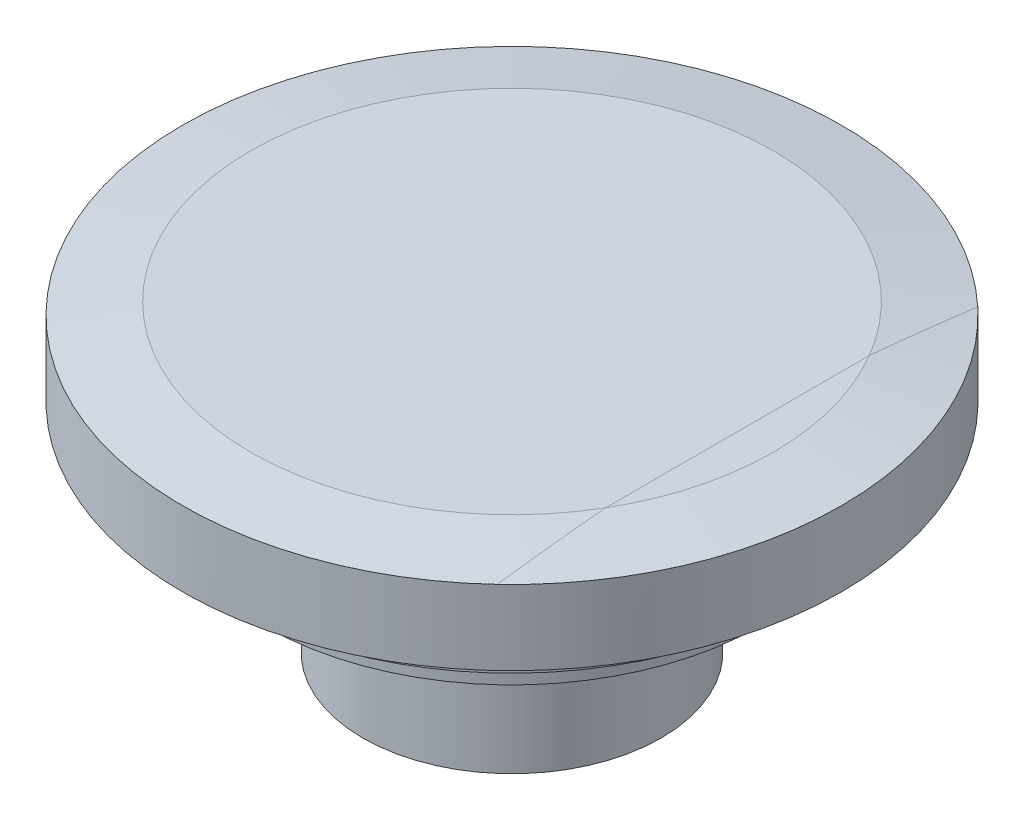
ISO-10303-21;
HEADER;
FILE_DESCRIPTION(('STEP AP214'),'2;1');
FILE_NAME('part.step','',(''),(''),'','','');
FILE_SCHEMA(('AUTOMOTIVE_DESIGN { 1 0 10303 214 1 1 1 1 }'));
ENDSEC;
DATA;
#1=APPLICATION_CONTEXT('core data for automotive mechanical design processes');
#2=APPLICATION_PROTOCOL_DEFINITION('international standard','automotive_design',2000,#1);
#3=PRODUCT_CONTEXT('',#1,'mechanical');
#4=PRODUCT('Part','Part','',(#3));
#5=PRODUCT_RELATED_PRODUCT_CATEGORY('part','',(#4));
#6=PRODUCT_DEFINITION_FORMATION('','',#4);
#7=PRODUCT_DEFINITION_CONTEXT('part definition',#1,'design');
#8=PRODUCT_DEFINITION('design','',#6,#7);
#9=PRODUCT_DEFINITION_SHAPE('','',#8);
#10=(LENGTH_UNIT() NAMED_UNIT(*) SI_UNIT(.MILLI.,.METRE.));
#11=(NAMED_UNIT(*) PLANE_ANGLE_UNIT() SI_UNIT($,.RADIAN.));
#12=(NAMED_UNIT(*) SI_UNIT($,.STERADIAN.) SOLID_ANGLE_UNIT());
#13=UNCERTAINTY_MEASURE_WITH_UNIT(LENGTH_MEASURE(1.E-05),#10,'distance_accuracy_value','');
#14=(GEOMETRIC_REPRESENTATION_CONTEXT(3) GLOBAL_UNCERTAINTY_ASSIGNED_CONTEXT((#13)) GLOBAL_UNIT_ASSIGNED_CONTEXT((#10,
#11,#12)) REPRESENTATION_CONTEXT('',''));
#15=CARTESIAN_POINT('',(0.,0.,0.));
#16=DIRECTION('',(0.,0.,1.));
#17=DIRECTION('',(1.,0.,0.));
#18=AXIS2_PLACEMENT_3D('',#15,#16,#17);
#19=CARTESIAN_POINT('',(0.,9.98173626503273,0.));
#20=DIRECTION('',(0.,-1.,0.));
#21=DIRECTION('',(1.,0.,0.));
#22=AXIS2_PLACEMENT_3D('',#19,#20,#21);
#23=CONICAL_SURFACE('',#22,19.,1.39626340159547);
#24=CARTESIAN_POINT('',(0.,9.98173626503273,0.));
#25=DIRECTION('',(0.,-1.,0.));
#26=DIRECTION('',(1.,0.,0.));
#27=AXIS2_PLACEMENT_3D('',#24,#25,#26);
#28=CIRCLE('',#27,19.);
#29=CARTESIAN_POINT('',(13.,9.98173626503273,13.856406460551));
#30=VERTEX_POINT('',#29);
#31=CARTESIAN_POINT('',(13.,9.98173626503273,-13.856406460551));
#32=VERTEX_POINT('',#31);
#33=EDGE_CURVE('E98',#30,#32,#28,.T.);
#34=ORIENTED_EDGE('',*,*,#33,.F.);
#35=CARTESIAN_POINT('',(13.,7.48753906557559,30.4895161654745));
#36=CARTESIAN_POINT('',(13.,7.59163470251432,29.8476905336172));
#37=CARTESIAN_POINT('',(13.,7.69525205259964,29.2057869232764));
#38=CARTESIAN_POINT('',(13.,7.90132133009502,27.9217911718034));
#39=CARTESIAN_POINT('',(13.,8.00377325475052,27.2796990302292));
#40=CARTESIAN_POINT('',(13.,8.20730663512683,25.9952695608044));
#41=CARTESIAN_POINT('',(13.,8.30838803280167,25.3529322237462));
#42=CARTESIAN_POINT('',(13.,8.50890126508268,24.0680001913044));
#43=CARTESIAN_POINT('',(13.,8.60833310045929,23.4254054960411));
#44=CARTESIAN_POINT('',(13.,8.8058215589137,22.135886040919));
#45=CARTESIAN_POINT('',(13.,8.90386567241708,21.4889593626281));
#46=CARTESIAN_POINT('',(13.,9.09749360698895,20.1947380838925));
#47=CARTESIAN_POINT('',(13.,9.1930774310512,19.5474434838964));
#48=CARTESIAN_POINT('',(13.,9.38121767825515,18.2524125259976));
#49=CARTESIAN_POINT('',(13.,9.47377409710544,17.60467616747));
#50=CARTESIAN_POINT('',(13.,9.65513012840587,16.3086758796796));
#51=CARTESIAN_POINT('',(13.,9.74392973962961,15.6604119502446));
#52=CARTESIAN_POINT('',(13.,9.91554450910703,14.3729191267315));
#53=CARTESIAN_POINT('',(13.,9.99842911968299,13.7336995266951));
#54=CARTESIAN_POINT('',(13.,10.1584918602058,12.4545416986967));
#55=CARTESIAN_POINT('',(13.,10.2356699840901,11.8146034699719));
#56=CARTESIAN_POINT('',(13.,10.3828775257037,10.5338495345427));
#57=CARTESIAN_POINT('',(13.,10.4529063941772,9.89303376424634));
#58=CARTESIAN_POINT('',(13.,10.5840330592408,8.61047919203077));
#59=CARTESIAN_POINT('',(13.,10.6451308435742,7.96874038884601));
#60=CARTESIAN_POINT('',(13.,10.7561400198527,6.68643607556363));
#61=CARTESIAN_POINT('',(13.,10.8060879746129,6.04587377159681));
#62=CARTESIAN_POINT('',(13.,10.8928652024007,4.76386474126162));
#63=CARTESIAN_POINT('',(13.,10.9296948485199,4.12241804056692));
#64=CARTESIAN_POINT('',(13.,10.9882185137485,2.83898342444468));
#65=CARTESIAN_POINT('',(13.,11.0099163632756,2.19699568720111));
#66=CARTESIAN_POINT('',(13.,11.0368061893442,0.912673419967469));
#67=CARTESIAN_POINT('',(13.,11.0419983339154,0.270338893574325));
#68=CARTESIAN_POINT('',(13.,11.0355988101753,-0.998977350105746));
#69=CARTESIAN_POINT('',(13.,11.0244031296896,-1.62596110371077));
#70=CARTESIAN_POINT('',(13.,10.9866710029589,-2.87945760004488));
#71=CARTESIAN_POINT('',(13.,10.9601344086011,-3.50597033816794));
#72=CARTESIAN_POINT('',(13.,10.8597820193976,-5.38469318401634));
#73=CARTESIAN_POINT('',(13.,10.7652261946311,-6.63580943363814));
#74=CARTESIAN_POINT('',(13.,10.5937088417883,-8.51164386407171));
#75=CARTESIAN_POINT('',(13.,10.5314606473325,-9.13782352486299));
#76=CARTESIAN_POINT('',(13.,10.398934935354,-10.3893424884136));
#77=CARTESIAN_POINT('',(13.,10.3286574285559,-11.0146817922943));
#78=CARTESIAN_POINT('',(13.,10.1816515334218,-12.264532290718));
#79=CARTESIAN_POINT('',(13.,10.1049237524224,-12.8890435576142));
#80=CARTESIAN_POINT('',(13.,9.94629152538928,-14.137405838054));
#81=CARTESIAN_POINT('',(13.,9.86438708386863,-14.7612568521726));
#82=CARTESIAN_POINT('',(13.,9.69517801003425,-16.017605324806));
#83=CARTESIAN_POINT('',(13.,9.60781148976589,-16.6500944133672));
#84=CARTESIAN_POINT('',(13.,9.42962931159165,-17.9145851118954));
#85=CARTESIAN_POINT('',(13.,9.33881365458644,-18.5465867219897));
#86=CARTESIAN_POINT('',(13.,9.15438385894502,-19.8101874123));
#87=CARTESIAN_POINT('',(13.,9.06076969081229,-20.4417864882017));
#88=CARTESIAN_POINT('',(13.,8.87125402005245,-21.704641526758));
#89=CARTESIAN_POINT('',(13.,8.77535251497298,-22.3358974890441));
#90=CARTESIAN_POINT('',(13.,8.58223982468661,-23.5943666770609));
#91=CARTESIAN_POINT('',(13.,8.48503981913002,-24.2215816204942));
#92=CARTESIAN_POINT('',(13.,8.28908854676353,-25.4757691975206));
#93=CARTESIAN_POINT('',(13.,8.19033727928474,-26.1027418310091));
#94=CARTESIAN_POINT('',(13.,7.99154041317272,-27.3564498902704));
#95=CARTESIAN_POINT('',(13.,7.89149487876872,-27.9831853262378));
#96=CARTESIAN_POINT('',(13.,7.69029805400471,-29.2364773597436));
#97=CARTESIAN_POINT('',(13.,7.5891467660267,-29.8630339576643));
#98=CARTESIAN_POINT('',(13.,7.48753906557559,-30.4895161654745));
#99=B_SPLINE_CURVE_WITH_KNOTS('',3,(#35,#36,#37,#38,#39,#40,#41,#42,#43,#44,#45,#46,#47,#48,#49,
#50,#51,#52,#53,#54,#55,#56,#57,#58,#59,#60,#61,#62,#63,#64,#65,#66,#67,#68,#69,#70,#71,#72,#73,
#74,#75,#76,#77,#78,#79,#80,#81,#82,#83,#84,#85,#86,#87,#88,#89,#90,#91,#92,#93,#94,#95,#96,#97,
#98),.UNSPECIFIED.,.F.,.F.,(4,2,2,2,2,2,2,2,2,2,2,2,2,2,2,2,2,2,2,2,2,2,2,2,2,2,2,2,2,2,2,4),
(0.,1.95063733751736,3.90127928453466,5.85200359067993,7.80272698570068,9.76566507352978,
11.7286007726886,13.6915392542315,15.6544783765623,17.5881706616603,19.5218650010976,
21.4557077888106,23.3895532304317,25.3169608260723,27.2443136008445,29.1711783140515,
31.0980234115189,32.9790708706674,34.8601364911848,38.6231024232312,40.5108799595391,
42.3986549744106,44.2862524412546,46.1738482624777,48.0893205989275,50.0047924351898,
51.9202844677934,53.8357785541836,55.7398817816886,57.6439858302506,59.5479957455857,
61.4520015601428),.UNSPECIFIED.);
#100=CARTESIAN_POINT('',(13.,10.6763289757004,7.60439100181148));
#101=VERTEX_POINT('',#100);
#102=EDGE_CURVE('E13',#30,#101,#99,.T.);
#103=ORIENTED_EDGE('',*,*,#102,.T.);
#104=CARTESIAN_POINT('',(0.,10.6763289757004,0.));
#105=DIRECTION('',(0.,-1.,0.));
#106=DIRECTION('',(1.,0.,0.));
#107=AXIS2_PLACEMENT_3D('',#104,#105,#106);
#108=CIRCLE('',#107,15.0607689879512);
#109=CARTESIAN_POINT('',(13.,10.6763289757004,-7.60439100181148));
#110=VERTEX_POINT('',#109);
#111=EDGE_CURVE('E96',#101,#110,#108,.T.);
#112=ORIENTED_EDGE('',*,*,#111,.T.);
#113=EDGE_CURVE('E78',#110,#32,#99,.T.);
#114=ORIENTED_EDGE('',*,*,#113,.T.);
#115=EDGE_LOOP('',(#34,#103,#112,#114));
#116=FACE_BOUND('',#115,.T.);
#117=ADVANCED_FACE('F67',(#116),#23,.T.);
#118=CARTESIAN_POINT('',(0.,10.6763289757004,0.));
#119=DIRECTION('',(0.,-1.,0.));
#120=DIRECTION('',(1.,0.,0.));
#121=AXIS2_PLACEMENT_3D('',#118,#119,#120);
#122=PLANE('',#121);
#123=DIRECTION('',(0.,0.,1.));
#124=VECTOR('',#123,1.);
#125=CARTESIAN_POINT('',(13.,10.6763289757004,0.));
#126=LINE('',#125,#124);
#127=EDGE_CURVE('E71',#110,#101,#126,.T.);
#128=ORIENTED_EDGE('',*,*,#127,.F.);
#129=ORIENTED_EDGE('',*,*,#111,.F.);
#130=EDGE_LOOP('',(#128,#129));
#131=FACE_BOUND('',#130,.T.);
#132=ADVANCED_FACE('F108',(#131),#122,.F.);
#133=EDGE_CURVE('E103',#110,#101,#108,.T.);
#134=ORIENTED_EDGE('',*,*,#133,.F.);
#135=ORIENTED_EDGE('',*,*,#127,.T.);
#136=EDGE_LOOP('',(#134,#135));
#137=FACE_BOUND('',#136,.T.);
#138=ADVANCED_FACE('F102',(#137),#122,.F.);
#139=ORIENTED_EDGE('',*,*,#102,.F.);
#140=EDGE_CURVE('E306',#32,#30,#28,.T.);
#141=ORIENTED_EDGE('',*,*,#140,.F.);
#142=ORIENTED_EDGE('',*,*,#113,.F.);
#143=ORIENTED_EDGE('',*,*,#133,.T.);
#144=EDGE_LOOP('',(#139,#141,#142,#143));
#145=FACE_BOUND('',#144,.T.);
#146=ADVANCED_FACE('F106',(#145),#23,.T.);
#147=CARTESIAN_POINT('',(0.,-1.57367102429958,0.));
#148=DIRECTION('',(0.,-1.,0.));
#149=DIRECTION('',(1.,0.,0.));
#150=AXIS2_PLACEMENT_3D('',#147,#148,#149);
#151=CYLINDRICAL_SURFACE('',#150,19.);
#152=ORIENTED_EDGE('',*,*,#33,.T.);
#153=ORIENTED_EDGE('',*,*,#140,.T.);
#154=EDGE_LOOP('',(#152,#153));
#155=FACE_BOUND('',#154,.T.);
#156=CARTESIAN_POINT('',(0.,5.67632897570042,0.));
#157=DIRECTION('',(0.,-1.,0.));
#158=DIRECTION('',(1.,0.,0.));
#159=AXIS2_PLACEMENT_3D('',#156,#157,#158);
#160=CIRCLE('',#159,19.);
#161=CARTESIAN_POINT('',(19.,5.67632897570042,0.));
#162=VERTEX_POINT('',#161);
#163=EDGE_CURVE('E299',#162,#162,#160,.T.);
#164=ORIENTED_EDGE('',*,*,#163,.F.);
#165=EDGE_LOOP('',(#164));
#166=FACE_BOUND('',#165,.T.);
#167=ADVANCED_FACE('F118',(#155,#166),#151,.T.);
#168=CARTESIAN_POINT('',(0.,3.42632897570042,0.));
#169=DIRECTION('',(0.,1.,0.));
#170=DIRECTION('',(-1.,0.,0.));
#171=AXIS2_PLACEMENT_3D('',#168,#169,#170);
#172=PLANE('',#171);
#173=CARTESIAN_POINT('',(0.,3.42632897570042,0.));
#174=DIRECTION('',(0.,-1.,0.));
#175=DIRECTION('',(1.,0.,0.));
#176=AXIS2_PLACEMENT_3D('',#173,#174,#175);
#177=CIRCLE('',#176,5.6);
#178=CARTESIAN_POINT('',(5.6,3.42632897570042,0.));
#179=VERTEX_POINT('',#178);
#180=EDGE_CURVE('E296',#179,#179,#177,.T.);
#181=ORIENTED_EDGE('',*,*,#180,.T.);
#182=EDGE_LOOP('',(#181));
#183=FACE_BOUND('',#182,.T.);
#184=ADVANCED_FACE('F127',(#183),#172,.F.);
#185=CARTESIAN_POINT('',(0.,-1.57367102429958,0.));
#186=DIRECTION('',(0.,-1.,0.));
#187=DIRECTION('',(1.,0.,0.));
#188=AXIS2_PLACEMENT_3D('',#185,#186,#187);
#189=CYLINDRICAL_SURFACE('',#188,5.6);
#190=ORIENTED_EDGE('',*,*,#180,.F.);
#191=EDGE_LOOP('',(#190));
#192=FACE_BOUND('',#191,.T.);
#193=CARTESIAN_POINT('',(0.,-6.82367102429958,0.));
#194=DIRECTION('',(0.,-1.,0.));
#195=DIRECTION('',(1.,0.,0.));
#196=AXIS2_PLACEMENT_3D('',#193,#194,#195);
#197=CIRCLE('',#196,5.6);
#198=CARTESIAN_POINT('',(5.6,-6.82367102429958,0.));
#199=VERTEX_POINT('',#198);
#200=EDGE_CURVE('E293',#199,#199,#197,.T.);
#201=ORIENTED_EDGE('',*,*,#200,.T.);
#202=EDGE_LOOP('',(#201));
#203=FACE_BOUND('',#202,.T.);
#204=ADVANCED_FACE('F156',(#192,#203),#189,.F.);
#205=CARTESIAN_POINT('',(0.,-6.82367102429958,0.));
#206=DIRECTION('',(0.,1.,0.));
#207=DIRECTION('',(-1.,0.,0.));
#208=AXIS2_PLACEMENT_3D('',#205,#206,#207);
#209=PLANE('',#208);
#210=ORIENTED_EDGE('',*,*,#200,.F.);
#211=EDGE_LOOP('',(#210));
#212=FACE_BOUND('',#211,.T.);
#213=CARTESIAN_POINT('',(0.,-6.82367102429958,0.));
#214=DIRECTION('',(0.,-1.,0.));
#215=DIRECTION('',(1.,0.,0.));
#216=AXIS2_PLACEMENT_3D('',#213,#214,#215);
#217=CIRCLE('',#216,8.6);
#218=CARTESIAN_POINT('',(8.6,-6.82367102429958,0.));
#219=VERTEX_POINT('',#218);
#220=EDGE_CURVE('E290',#219,#219,#217,.T.);
#221=ORIENTED_EDGE('',*,*,#220,.T.);
#222=EDGE_LOOP('',(#221));
#223=FACE_BOUND('',#222,.T.);
#224=ADVANCED_FACE('F160',(#212,#223),#209,.F.);
#225=CARTESIAN_POINT('',(0.,-1.57367102429958,0.));
#226=DIRECTION('',(0.,-1.,0.));
#227=DIRECTION('',(1.,0.,0.));
#228=AXIS2_PLACEMENT_3D('',#225,#226,#227);
#229=CYLINDRICAL_SURFACE('',#228,8.6);
#230=ORIENTED_EDGE('',*,*,#220,.F.);
#231=EDGE_LOOP('',(#230));
#232=FACE_BOUND('',#231,.T.);
#233=CARTESIAN_POINT('',(0.,-0.32367102429958,0.));
#234=DIRECTION('',(0.,-1.,0.));
#235=DIRECTION('',(1.,0.,0.));
#236=AXIS2_PLACEMENT_3D('',#233,#234,#235);
#237=CIRCLE('',#236,8.6);
#238=CARTESIAN_POINT('',(8.6,-0.32367102429958,0.));
#239=VERTEX_POINT('',#238);
#240=EDGE_CURVE('E287',#239,#239,#237,.T.);
#241=ORIENTED_EDGE('',*,*,#240,.T.);
#242=EDGE_LOOP('',(#241));
#243=FACE_BOUND('',#242,.T.);
#244=ADVANCED_FACE('F164',(#232,#243),#229,.T.);
#245=CARTESIAN_POINT('',(0.,-0.32367102429958,0.));
#246=DIRECTION('',(0.,1.,0.));
#247=DIRECTION('',(-1.,0.,0.));
#248=AXIS2_PLACEMENT_3D('',#245,#246,#247);
#249=PLANE('',#248);
#250=ORIENTED_EDGE('',*,*,#240,.F.);
#251=EDGE_LOOP('',(#250));
#252=FACE_BOUND('',#251,.T.);
#253=CARTESIAN_POINT('',(0.,-0.32367102429958,0.));
#254=DIRECTION('',(0.,-1.,0.));
#255=DIRECTION('',(1.,0.,0.));
#256=AXIS2_PLACEMENT_3D('',#253,#254,#255);
#257=CIRCLE('',#256,10.35);
#258=CARTESIAN_POINT('',(10.35,-0.32367102429958,0.));
#259=VERTEX_POINT('',#258);
#260=EDGE_CURVE('E284',#259,#259,#257,.T.);
#261=ORIENTED_EDGE('',*,*,#260,.T.);
#262=EDGE_LOOP('',(#261));
#263=FACE_BOUND('',#262,.T.);
#264=ADVANCED_FACE('F168',(#252,#263),#249,.F.);
#265=CARTESIAN_POINT('',(0.,-0.32367102429958,0.));
#266=DIRECTION('',(0.,1.,0.));
#267=DIRECTION('',(-1.,0.,0.));
#268=AXIS2_PLACEMENT_3D('',#265,#266,#267);
#269=TOROIDAL_SURFACE('',#268,11.35,1.);
#270=CARTESIAN_POINT('',(0.,0.67632897570042,0.));
#271=DIRECTION('',(0.,1.,0.));
#272=DIRECTION('',(-1.,0.,0.));
#273=AXIS2_PLACEMENT_3D('',#270,#271,#272);
#274=CIRCLE('',#273,11.35);
#275=CARTESIAN_POINT('',(-11.35,0.67632897570042,0.));
#276=VERTEX_POINT('',#275);
#277=EDGE_CURVE('E278',#276,#276,#274,.T.);
#278=ORIENTED_EDGE('',*,*,#277,.F.);
#279=EDGE_LOOP('',(#278));
#280=FACE_BOUND('',#279,.T.);
#281=ORIENTED_EDGE('',*,*,#260,.F.);
#282=EDGE_LOOP('',(#281));
#283=FACE_BOUND('',#282,.T.);
#284=ADVANCED_FACE('F172',(#280,#283),#269,.F.);
#285=CARTESIAN_POINT('',(0.,0.67632897570042,0.));
#286=DIRECTION('',(0.,1.,0.));
#287=DIRECTION('',(-1.,0.,0.));
#288=AXIS2_PLACEMENT_3D('',#285,#286,#287);
#289=PLANE('',#288);
#290=ORIENTED_EDGE('',*,*,#277,.T.);
#291=EDGE_LOOP('',(#290));
#292=FACE_BOUND('',#291,.T.);
#293=CARTESIAN_POINT('',(0.,0.67632897570042,0.));
#294=DIRECTION('',(0.,-1.,0.));
#295=DIRECTION('',(1.,0.,0.));
#296=AXIS2_PLACEMENT_3D('',#293,#294,#295);
#297=CIRCLE('',#296,12.35);
#298=CARTESIAN_POINT('',(12.35,0.67632897570042,0.));
#299=VERTEX_POINT('',#298);
#300=EDGE_CURVE('E281',#299,#299,#297,.T.);
#301=ORIENTED_EDGE('',*,*,#300,.T.);
#302=EDGE_LOOP('',(#301));
#303=FACE_BOUND('',#302,.T.);
#304=ADVANCED_FACE('F174',(#292,#303),#289,.F.);
#305=CARTESIAN_POINT('',(0.,0.676328975700419,0.));
#306=DIRECTION('',(0.,1.,0.));
#307=DIRECTION('',(-1.,0.,0.));
#308=AXIS2_PLACEMENT_3D('',#305,#306,#307);
#309=TOROIDAL_SURFACE('',#308,13.35,1.);
#310=CARTESIAN_POINT('',(0.,1.67632897570042,0.));
#311=DIRECTION('',(0.,1.,0.));
#312=DIRECTION('',(-1.,0.,0.));
#313=AXIS2_PLACEMENT_3D('',#310,#311,#312);
#314=CIRCLE('',#313,13.35);
#315=CARTESIAN_POINT('',(-13.35,1.67632897570042,0.));
#316=VERTEX_POINT('',#315);
#317=EDGE_CURVE('E275',#316,#316,#314,.T.);
#318=ORIENTED_EDGE('',*,*,#317,.F.);
#319=EDGE_LOOP('',(#318));
#320=FACE_BOUND('',#319,.T.);
#321=ORIENTED_EDGE('',*,*,#300,.F.);
#322=EDGE_LOOP('',(#321));
#323=FACE_BOUND('',#322,.T.);
#324=ADVANCED_FACE('F135',(#320,#323),#309,.F.);
#325=CARTESIAN_POINT('',(0.,1.67632897570042,0.));
#326=DIRECTION('',(0.,1.,0.));
#327=DIRECTION('',(-1.,0.,0.));
#328=AXIS2_PLACEMENT_3D('',#325,#326,#327);
#329=PLANE('',#328);
#330=ORIENTED_EDGE('',*,*,#317,.T.);
#331=EDGE_LOOP('',(#330));
#332=FACE_BOUND('',#331,.T.);
#333=CARTESIAN_POINT('',(0.,1.67632897570042,0.));
#334=DIRECTION('',(0.,-1.,0.));
#335=DIRECTION('',(1.,0.,0.));
#336=AXIS2_PLACEMENT_3D('',#333,#334,#335);
#337=CIRCLE('',#336,14.35);
#338=CARTESIAN_POINT('',(14.35,1.67632897570042,0.));
#339=VERTEX_POINT('',#338);
#340=EDGE_CURVE('E304',#339,#339,#337,.T.);
#341=ORIENTED_EDGE('',*,*,#340,.T.);
#342=EDGE_LOOP('',(#341));
#343=FACE_BOUND('',#342,.T.);
#344=ADVANCED_FACE('F131',(#332,#343),#329,.F.);
#345=CARTESIAN_POINT('',(0.,-1.57367102429958,0.));
#346=DIRECTION('',(0.,-1.,0.));
#347=DIRECTION('',(1.,0.,0.));
#348=AXIS2_PLACEMENT_3D('',#345,#346,#347);
#349=CYLINDRICAL_SURFACE('',#348,14.35);
#350=CARTESIAN_POINT('',(0.,2.67632897570042,0.));
#351=DIRECTION('',(0.,1.,0.));
#352=DIRECTION('',(-1.,0.,0.));
#353=AXIS2_PLACEMENT_3D('',#350,#351,#352);
#354=CIRCLE('',#353,14.35);
#355=CARTESIAN_POINT('',(-14.35,2.67632897570042,0.));
#356=VERTEX_POINT('',#355);
#357=EDGE_CURVE('E272',#356,#356,#354,.F.);
#358=ORIENTED_EDGE('',*,*,#357,.T.);
#359=EDGE_LOOP('',(#358));
#360=FACE_BOUND('',#359,.T.);
#361=ORIENTED_EDGE('',*,*,#340,.F.);
#362=EDGE_LOOP('',(#361));
#363=FACE_BOUND('',#362,.T.);
#364=ADVANCED_FACE('F134',(#360,#363),#349,.T.);
#365=CARTESIAN_POINT('',(0.,2.67632897570042,0.));
#366=DIRECTION('',(0.,1.,0.));
#367=DIRECTION('',(-1.,0.,0.));
#368=AXIS2_PLACEMENT_3D('',#365,#366,#367);
#369=TOROIDAL_SURFACE('',#368,15.35,1.);
#370=CARTESIAN_POINT('',(0.,3.67632897570042,0.));
#371=DIRECTION('',(0.,1.,0.));
#372=DIRECTION('',(-1.,0.,0.));
#373=AXIS2_PLACEMENT_3D('',#370,#371,#372);
#374=CIRCLE('',#373,15.35);
#375=CARTESIAN_POINT('',(-15.35,3.67632897570042,0.));
#376=VERTEX_POINT('',#375);
#377=EDGE_CURVE('E269',#376,#376,#374,.T.);
#378=ORIENTED_EDGE('',*,*,#377,.F.);
#379=EDGE_LOOP('',(#378));
#380=FACE_BOUND('',#379,.T.);
#381=ORIENTED_EDGE('',*,*,#357,.F.);
#382=EDGE_LOOP('',(#381));
#383=FACE_BOUND('',#382,.T.);
#384=ADVANCED_FACE('F139',(#380,#383),#369,.F.);
#385=CARTESIAN_POINT('',(0.,3.67632897570042,0.));
#386=DIRECTION('',(0.,1.,0.));
#387=DIRECTION('',(-1.,0.,0.));
#388=AXIS2_PLACEMENT_3D('',#385,#386,#387);
#389=PLANE('',#388);
#390=ORIENTED_EDGE('',*,*,#377,.T.);
#391=EDGE_LOOP('',(#390));
#392=FACE_BOUND('',#391,.T.);
#393=CARTESIAN_POINT('',(0.,3.67632897570042,0.));
#394=DIRECTION('',(0.,-1.,0.));
#395=DIRECTION('',(1.,0.,0.));
#396=AXIS2_PLACEMENT_3D('',#393,#394,#395);
#397=CIRCLE('',#396,16.35);
#398=CARTESIAN_POINT('',(16.35,3.67632897570042,0.));
#399=VERTEX_POINT('',#398);
#400=EDGE_CURVE('E302',#399,#399,#397,.T.);
#401=ORIENTED_EDGE('',*,*,#400,.T.);
#402=EDGE_LOOP('',(#401));
#403=FACE_BOUND('',#402,.T.);
#404=ADVANCED_FACE('F141',(#392,#403),#389,.F.);
#405=CARTESIAN_POINT('',(0.,-1.57367102429958,0.));
#406=DIRECTION('',(0.,-1.,0.));
#407=DIRECTION('',(1.,0.,0.));
#408=AXIS2_PLACEMENT_3D('',#405,#406,#407);
#409=CYLINDRICAL_SURFACE('',#408,16.35);
#410=CARTESIAN_POINT('',(0.,4.67632897570042,0.));
#411=DIRECTION('',(0.,-1.,0.));
#412=DIRECTION('',(1.,0.,0.));
#413=AXIS2_PLACEMENT_3D('',#410,#411,#412);
#414=CIRCLE('',#413,16.35);
#415=CARTESIAN_POINT('',(16.35,4.67632897570042,0.));
#416=VERTEX_POINT('',#415);
#417=EDGE_CURVE('E266',#416,#416,#414,.T.);
#418=ORIENTED_EDGE('',*,*,#417,.T.);
#419=EDGE_LOOP('',(#418));
#420=FACE_BOUND('',#419,.T.);
#421=ORIENTED_EDGE('',*,*,#400,.F.);
#422=EDGE_LOOP('',(#421));
#423=FACE_BOUND('',#422,.T.);
#424=ADVANCED_FACE('F144',(#420,#423),#409,.T.);
#425=CARTESIAN_POINT('',(0.,4.67632897570042,0.));
#426=DIRECTION('',(0.,-1.,0.));
#427=DIRECTION('',(1.,0.,0.));
#428=AXIS2_PLACEMENT_3D('',#425,#426,#427);
#429=TOROIDAL_SURFACE('',#428,17.35,1.);
#430=CARTESIAN_POINT('',(0.,5.67632897570042,0.));
#431=DIRECTION('',(0.,-1.,0.));
#432=DIRECTION('',(1.,0.,0.));
#433=AXIS2_PLACEMENT_3D('',#430,#431,#432);
#434=CIRCLE('',#433,17.35);
#435=CARTESIAN_POINT('',(17.35,5.67632897570042,0.));
#436=VERTEX_POINT('',#435);
#437=EDGE_CURVE('E263',#436,#436,#434,.F.);
#438=ORIENTED_EDGE('',*,*,#437,.F.);
#439=EDGE_LOOP('',(#438));
#440=FACE_BOUND('',#439,.T.);
#441=ORIENTED_EDGE('',*,*,#417,.F.);
#442=EDGE_LOOP('',(#441));
#443=FACE_BOUND('',#442,.T.);
#444=ADVANCED_FACE('F148',(#440,#443),#429,.F.);
#445=CARTESIAN_POINT('',(0.,5.67632897570042,0.));
#446=DIRECTION('',(0.,-1.,0.));
#447=DIRECTION('',(1.,0.,0.));
#448=AXIS2_PLACEMENT_3D('',#445,#446,#447);
#449=PLANE('',#448);
#450=ORIENTED_EDGE('',*,*,#437,.T.);
#451=EDGE_LOOP('',(#450));
#452=FACE_BOUND('',#451,.T.);
#453=ORIENTED_EDGE('',*,*,#163,.T.);
#454=EDGE_LOOP('',(#453));
#455=FACE_BOUND('',#454,.T.);
#456=ADVANCED_FACE('F150',(#452,#455),#449,.T.);
#457=CLOSED_SHELL('',(#117,#132,#138,#146,#167,#184,#204,#224,#244,#264,#284,#304,#324,#344,
#364,#384,#404,#424,#444,#456));
#458=CARTESIAN_POINT('',(0.,9.47632897570042,0.));
#459=DIRECTION('',(0.,1.,0.));
#460=DIRECTION('',(-1.,0.,0.));
#461=AXIS2_PLACEMENT_3D('',#458,#459,#460);
#462=PLANE('',#461);
#463=CARTESIAN_POINT('',(0.,9.47632897570042,0.));
#464=DIRECTION('',(0.,1.,0.));
#465=DIRECTION('',(-1.,0.,0.));
#466=AXIS2_PLACEMENT_3D('',#463,#464,#465);
#467=CIRCLE('',#466,17.8);
#468=CARTESIAN_POINT('',(-17.8,9.47632897570042,0.));
#469=VERTEX_POINT('',#468);
#470=EDGE_CURVE('E237',#469,#469,#467,.F.);
#471=ORIENTED_EDGE('',*,*,#470,.T.);
#472=EDGE_LOOP('',(#471));
#473=FACE_BOUND('',#472,.T.);
#474=ADVANCED_FACE('F119',(#473),#462,.F.);
#475=CARTESIAN_POINT('',(0.,4.62632897570042,0.));
#476=DIRECTION('',(0.,1.,0.));
#477=DIRECTION('',(-1.,0.,0.));
#478=AXIS2_PLACEMENT_3D('',#475,#476,#477);
#479=PLANE('',#478);
#480=CARTESIAN_POINT('',(0.,4.62632897570042,0.));
#481=DIRECTION('',(0.,1.,0.));
#482=DIRECTION('',(-1.,0.,0.));
#483=AXIS2_PLACEMENT_3D('',#480,#481,#482);
#484=CIRCLE('',#483,7.4);
#485=CARTESIAN_POINT('',(-7.4,4.62632897570042,0.));
#486=VERTEX_POINT('',#485);
#487=EDGE_CURVE('E235',#486,#486,#484,.T.);
#488=ORIENTED_EDGE('',*,*,#487,.T.);
#489=EDGE_LOOP('',(#488));
#490=FACE_BOUND('',#489,.T.);
#491=ADVANCED_FACE('F122',(#490),#479,.T.);
#492=CARTESIAN_POINT('',(0.,25.5566896988222,0.));
#493=DIRECTION('',(0.,-1.,0.));
#494=DIRECTION('',(1.,0.,0.));
#495=AXIS2_PLACEMENT_3D('',#492,#493,#494);
#496=CYLINDRICAL_SURFACE('',#495,7.4);
#497=CARTESIAN_POINT('',(0.,0.876328975700419,0.));
#498=DIRECTION('',(0.,1.,0.));
#499=DIRECTION('',(-1.,0.,0.));
#500=AXIS2_PLACEMENT_3D('',#497,#498,#499);
#501=CIRCLE('',#500,7.4);
#502=CARTESIAN_POINT('',(-7.4,0.876328975700419,0.));
#503=VERTEX_POINT('',#502);
#504=EDGE_CURVE('E232',#503,#503,#501,.F.);
#505=ORIENTED_EDGE('',*,*,#504,.F.);
#506=EDGE_LOOP('',(#505));
#507=FACE_BOUND('',#506,.T.);
#508=ORIENTED_EDGE('',*,*,#487,.F.);
#509=EDGE_LOOP('',(#508));
#510=FACE_BOUND('',#509,.T.);
#511=ADVANCED_FACE('F221',(#507,#510),#496,.T.);
#512=CARTESIAN_POINT('',(0.,0.87632897570042,0.));
#513=DIRECTION('',(0.,1.,0.));
#514=DIRECTION('',(-1.,0.,0.));
#515=AXIS2_PLACEMENT_3D('',#512,#513,#514);
#516=PLANE('',#515);
#517=ORIENTED_EDGE('',*,*,#504,.T.);
#518=EDGE_LOOP('',(#517));
#519=FACE_BOUND('',#518,.T.);
#520=CARTESIAN_POINT('',(0.,0.87632897570042,0.));
#521=DIRECTION('',(0.,-1.,0.));
#522=DIRECTION('',(1.,0.,0.));
#523=AXIS2_PLACEMENT_3D('',#520,#521,#522);
#524=CIRCLE('',#523,9.50609110854142);
#525=CARTESIAN_POINT('',(9.50609110854142,0.87632897570042,0.));
#526=VERTEX_POINT('',#525);
#527=EDGE_CURVE('E240',#526,#526,#524,.T.);
#528=ORIENTED_EDGE('',*,*,#527,.F.);
#529=EDGE_LOOP('',(#528));
#530=FACE_BOUND('',#529,.T.);
#531=ADVANCED_FACE('F217',(#519,#530),#516,.T.);
#532=CARTESIAN_POINT('',(0.,-0.32367102429958,0.));
#533=DIRECTION('',(0.,1.,0.));
#534=DIRECTION('',(-1.,0.,0.));
#535=AXIS2_PLACEMENT_3D('',#532,#533,#534);
#536=TOROIDAL_SURFACE('',#535,11.35,2.2);
#537=CARTESIAN_POINT('',(0.,1.87632897570042,0.));
#538=DIRECTION('',(0.,1.,0.));
#539=DIRECTION('',(-1.,0.,0.));
#540=AXIS2_PLACEMENT_3D('',#537,#538,#539);
#541=CIRCLE('',#540,11.35);
#542=CARTESIAN_POINT('',(-11.35,1.87632897570042,0.));
#543=VERTEX_POINT('',#542);
#544=EDGE_CURVE('E245',#543,#543,#541,.T.);
#545=ORIENTED_EDGE('',*,*,#544,.T.);
#546=EDGE_LOOP('',(#545));
#547=FACE_BOUND('',#546,.T.);
#548=ORIENTED_EDGE('',*,*,#527,.T.);
#549=EDGE_LOOP('',(#548));
#550=FACE_BOUND('',#549,.T.);
#551=ADVANCED_FACE('F213',(#547,#550),#536,.T.);
#552=CARTESIAN_POINT('',(0.,1.87632897570042,0.));
#553=DIRECTION('',(0.,1.,0.));
#554=DIRECTION('',(-1.,0.,0.));
#555=AXIS2_PLACEMENT_3D('',#552,#553,#554);
#556=PLANE('',#555);
#557=ORIENTED_EDGE('',*,*,#544,.F.);
#558=EDGE_LOOP('',(#557));
#559=FACE_BOUND('',#558,.T.);
#560=CARTESIAN_POINT('',(0.,1.87632897570042,0.));
#561=DIRECTION('',(0.,-1.,0.));
#562=DIRECTION('',(1.,0.,0.));
#563=AXIS2_PLACEMENT_3D('',#560,#561,#562);
#564=CIRCLE('',#563,11.5060911085414);
#565=CARTESIAN_POINT('',(11.5060911085414,1.87632897570042,0.));
#566=VERTEX_POINT('',#565);
#567=EDGE_CURVE('E244',#566,#566,#564,.T.);
#568=ORIENTED_EDGE('',*,*,#567,.F.);
#569=EDGE_LOOP('',(#568));
#570=FACE_BOUND('',#569,.T.);
#571=ADVANCED_FACE('F209',(#559,#570),#556,.T.);
#572=CARTESIAN_POINT('',(0.,0.676328975700419,0.));
#573=DIRECTION('',(0.,1.,0.));
#574=DIRECTION('',(-1.,0.,0.));
#575=AXIS2_PLACEMENT_3D('',#572,#573,#574);
#576=TOROIDAL_SURFACE('',#575,13.35,2.2);
#577=ORIENTED_EDGE('',*,*,#567,.T.);
#578=EDGE_LOOP('',(#577));
#579=FACE_BOUND('',#578,.T.);
#580=CARTESIAN_POINT('',(0.,2.86796650448172,0.));
#581=DIRECTION('',(0.,-1.,0.));
#582=DIRECTION('',(1.,0.,0.));
#583=AXIS2_PLACEMENT_3D('',#580,#581,#582);
#584=CIRCLE('',#583,13.1583624712187);
#585=CARTESIAN_POINT('',(13.1583624712187,2.86796650448172,0.));
#586=VERTEX_POINT('',#585);
#587=EDGE_CURVE('E255',#586,#586,#584,.T.);
#588=ORIENTED_EDGE('',*,*,#587,.F.);
#589=EDGE_LOOP('',(#588));
#590=FACE_BOUND('',#589,.T.);
#591=ADVANCED_FACE('F205',(#579,#590),#576,.T.);
#592=CARTESIAN_POINT('',(0.,2.67632897570042,0.));
#593=DIRECTION('',(0.,1.,0.));
#594=DIRECTION('',(-1.,0.,0.));
#595=AXIS2_PLACEMENT_3D('',#592,#593,#594);
#596=TOROIDAL_SURFACE('',#595,15.35,2.2);
#597=ORIENTED_EDGE('',*,*,#587,.T.);
#598=EDGE_LOOP('',(#597));
#599=FACE_BOUND('',#598,.T.);
#600=CARTESIAN_POINT('',(0.,4.86796650448169,0.));
#601=DIRECTION('',(0.,-1.,0.));
#602=DIRECTION('',(1.,0.,0.));
#603=AXIS2_PLACEMENT_3D('',#600,#601,#602);
#604=CIRCLE('',#603,15.1583624712187);
#605=CARTESIAN_POINT('',(15.1583624712187,4.86796650448169,0.));
#606=VERTEX_POINT('',#605);
#607=EDGE_CURVE('E260',#606,#606,#604,.T.);
#608=ORIENTED_EDGE('',*,*,#607,.F.);
#609=EDGE_LOOP('',(#608));
#610=FACE_BOUND('',#609,.T.);
#611=ADVANCED_FACE('F201',(#599,#610),#596,.T.);
#612=CARTESIAN_POINT('',(0.,4.67632897570042,0.));
#613=DIRECTION('',(0.,-1.,0.));
#614=DIRECTION('',(1.,0.,0.));
#615=AXIS2_PLACEMENT_3D('',#612,#613,#614);
#616=TOROIDAL_SURFACE('',#615,17.35,2.2);
#617=ORIENTED_EDGE('',*,*,#607,.T.);
#618=EDGE_LOOP('',(#617));
#619=FACE_BOUND('',#618,.T.);
#620=CARTESIAN_POINT('',(0.,6.87632897570042,0.));
#621=DIRECTION('',(0.,-1.,0.));
#622=DIRECTION('',(1.,0.,0.));
#623=AXIS2_PLACEMENT_3D('',#620,#621,#622);
#624=CIRCLE('',#623,17.35);
#625=CARTESIAN_POINT('',(17.35,6.87632897570042,0.));
#626=VERTEX_POINT('',#625);
#627=EDGE_CURVE('E248',#626,#626,#624,.F.);
#628=ORIENTED_EDGE('',*,*,#627,.T.);
#629=EDGE_LOOP('',(#628));
#630=FACE_BOUND('',#629,.T.);
#631=ADVANCED_FACE('F197',(#619,#630),#616,.T.);
#632=CARTESIAN_POINT('',(0.,6.87632897570042,0.));
#633=DIRECTION('',(0.,-1.,0.));
#634=DIRECTION('',(1.,0.,0.));
#635=AXIS2_PLACEMENT_3D('',#632,#633,#634);
#636=PLANE('',#635);
#637=ORIENTED_EDGE('',*,*,#627,.F.);
#638=EDGE_LOOP('',(#637));
#639=FACE_BOUND('',#638,.T.);
#640=CARTESIAN_POINT('',(0.,6.87632897570042,0.));
#641=DIRECTION('',(0.,-1.,0.));
#642=DIRECTION('',(1.,0.,0.));
#643=AXIS2_PLACEMENT_3D('',#640,#641,#642);
#644=CIRCLE('',#643,17.8);
#645=CARTESIAN_POINT('',(17.8,6.87632897570042,0.));
#646=VERTEX_POINT('',#645);
#647=EDGE_CURVE('E243',#646,#646,#644,.T.);
#648=ORIENTED_EDGE('',*,*,#647,.F.);
#649=EDGE_LOOP('',(#648));
#650=FACE_BOUND('',#649,.T.);
#651=ADVANCED_FACE('F193',(#639,#650),#636,.F.);
#652=CARTESIAN_POINT('',(0.,-1.57367102429958,0.));
#653=DIRECTION('',(0.,-1.,0.));
#654=DIRECTION('',(1.,0.,0.));
#655=AXIS2_PLACEMENT_3D('',#652,#653,#654);
#656=CYLINDRICAL_SURFACE('',#655,17.8);
#657=ORIENTED_EDGE('',*,*,#647,.T.);
#658=EDGE_LOOP('',(#657));
#659=FACE_BOUND('',#658,.T.);
#660=ORIENTED_EDGE('',*,*,#470,.F.);
#661=EDGE_LOOP('',(#660));
#662=FACE_BOUND('',#661,.T.);
#663=ADVANCED_FACE('F190',(#659,#662),#656,.F.);
#664=CLOSED_SHELL('',(#474,#491,#511,#531,#551,#571,#591,#611,#631,#651,#663));
#665=ORIENTED_CLOSED_SHELL('',*,#664,.T.);
#666=BREP_WITH_VOIDS('B2',#457,(#665));
#667=CARTESIAN_POINT('',(0.,-1.57367102429958,0.));
#668=DIRECTION('',(0.,-1.,0.));
#669=DIRECTION('',(1.,0.,0.));
#670=AXIS2_PLACEMENT_3D('',#667,#668,#669);
#671=CYLINDRICAL_SURFACE('',#670,17.8);
#672=CARTESIAN_POINT('',(0.,6.87632897570042,0.));
#673=DIRECTION('',(0.,-1.,0.));
#674=DIRECTION('',(1.,0.,0.));
#675=AXIS2_PLACEMENT_3D('',#672,#673,#674);
#676=CIRCLE('',#675,17.8);
#677=CARTESIAN_POINT('',(17.8,6.87632897570042,0.));
#678=VERTEX_POINT('',#677);
#679=EDGE_CURVE('E727',#678,#678,#676,.T.);
#680=ORIENTED_EDGE('',*,*,#679,.F.);
#681=EDGE_LOOP('',(#680));
#682=FACE_BOUND('',#681,.T.);
#683=CARTESIAN_POINT('',(0.,9.47632897570042,0.));
#684=DIRECTION('',(0.,1.,0.));
#685=DIRECTION('',(-1.,0.,0.));
#686=AXIS2_PLACEMENT_3D('',#683,#684,#685);
#687=CIRCLE('',#686,17.8);
#688=CARTESIAN_POINT('',(-17.8,9.47632897570042,0.));
#689=VERTEX_POINT('',#688);
#690=EDGE_CURVE('E719',#689,#689,#687,.F.);
#691=ORIENTED_EDGE('',*,*,#690,.T.);
#692=EDGE_LOOP('',(#691));
#693=FACE_BOUND('',#692,.T.);
#694=ADVANCED_FACE('F704',(#682,#693),#671,.T.);
#695=CARTESIAN_POINT('',(0.,6.87632897570042,0.));
#696=DIRECTION('',(0.,-1.,0.));
#697=DIRECTION('',(1.,0.,0.));
#698=AXIS2_PLACEMENT_3D('',#695,#696,#697);
#699=PLANE('',#698);
#700=CARTESIAN_POINT('',(0.,6.87632897570042,0.));
#701=DIRECTION('',(0.,-1.,0.));
#702=DIRECTION('',(1.,0.,0.));
#703=AXIS2_PLACEMENT_3D('',#700,#701,#702);
#704=CIRCLE('',#703,17.35);
#705=CARTESIAN_POINT('',(17.35,6.87632897570042,0.));
#706=VERTEX_POINT('',#705);
#707=EDGE_CURVE('E732',#706,#706,#704,.F.);
#708=ORIENTED_EDGE('',*,*,#707,.T.);
#709=EDGE_LOOP('',(#708));
#710=FACE_BOUND('',#709,.T.);
#711=ORIENTED_EDGE('',*,*,#679,.T.);
#712=EDGE_LOOP('',(#711));
#713=FACE_BOUND('',#712,.T.);
#714=ADVANCED_FACE('F758',(#710,#713),#699,.T.);
#715=CARTESIAN_POINT('',(0.,4.67632897570042,0.));
#716=DIRECTION('',(0.,-1.,0.));
#717=DIRECTION('',(1.,0.,0.));
#718=AXIS2_PLACEMENT_3D('',#715,#716,#717);
#719=TOROIDAL_SURFACE('',#718,17.35,2.2);
#720=CARTESIAN_POINT('',(0.,4.86796650448169,0.));
#721=DIRECTION('',(0.,-1.,0.));
#722=DIRECTION('',(1.,0.,0.));
#723=AXIS2_PLACEMENT_3D('',#720,#721,#722);
#724=CIRCLE('',#723,15.1583624712187);
#725=CARTESIAN_POINT('',(15.1583624712187,4.86796650448169,0.));
#726=VERTEX_POINT('',#725);
#727=EDGE_CURVE('E708',#726,#726,#724,.T.);
#728=ORIENTED_EDGE('',*,*,#727,.F.);
#729=EDGE_LOOP('',(#728));
#730=FACE_BOUND('',#729,.T.);
#731=ORIENTED_EDGE('',*,*,#707,.F.);
#732=EDGE_LOOP('',(#731));
#733=FACE_BOUND('',#732,.T.);
#734=ADVANCED_FACE('F755',(#730,#733),#719,.F.);
#735=CARTESIAN_POINT('',(0.,2.67632897570042,0.));
#736=DIRECTION('',(0.,1.,0.));
#737=DIRECTION('',(-1.,0.,0.));
#738=AXIS2_PLACEMENT_3D('',#735,#736,#737);
#739=TOROIDAL_SURFACE('',#738,15.35,2.2);
#740=CARTESIAN_POINT('',(0.,2.86796650448172,0.));
#741=DIRECTION('',(0.,-1.,0.));
#742=DIRECTION('',(1.,0.,0.));
#743=AXIS2_PLACEMENT_3D('',#740,#741,#742);
#744=CIRCLE('',#743,13.1583624712187);
#745=CARTESIAN_POINT('',(13.1583624712187,2.86796650448172,0.));
#746=VERTEX_POINT('',#745);
#747=EDGE_CURVE('E742',#746,#746,#744,.T.);
#748=ORIENTED_EDGE('',*,*,#747,.F.);
#749=EDGE_LOOP('',(#748));
#750=FACE_BOUND('',#749,.T.);
#751=ORIENTED_EDGE('',*,*,#727,.T.);
#752=EDGE_LOOP('',(#751));
#753=FACE_BOUND('',#752,.T.);
#754=ADVANCED_FACE('F753',(#750,#753),#739,.F.);
#755=CARTESIAN_POINT('',(0.,0.676328975700419,0.));
#756=DIRECTION('',(0.,1.,0.));
#757=DIRECTION('',(-1.,0.,0.));
#758=AXIS2_PLACEMENT_3D('',#755,#756,#757);
#759=TOROIDAL_SURFACE('',#758,13.35,2.2);
#760=CARTESIAN_POINT('',(0.,1.87632897570042,0.));
#761=DIRECTION('',(0.,-1.,0.));
#762=DIRECTION('',(1.,0.,0.));
#763=AXIS2_PLACEMENT_3D('',#760,#761,#762);
#764=CIRCLE('',#763,11.5060911085414);
#765=CARTESIAN_POINT('',(11.5060911085414,1.87632897570042,0.));
#766=VERTEX_POINT('',#765);
#767=EDGE_CURVE('E726',#766,#766,#764,.T.);
#768=ORIENTED_EDGE('',*,*,#767,.F.);
#769=EDGE_LOOP('',(#768));
#770=FACE_BOUND('',#769,.T.);
#771=ORIENTED_EDGE('',*,*,#747,.T.);
#772=EDGE_LOOP('',(#771));
#773=FACE_BOUND('',#772,.T.);
#774=ADVANCED_FACE('F794',(#770,#773),#759,.F.);
#775=CARTESIAN_POINT('',(0.,1.87632897570042,0.));
#776=DIRECTION('',(0.,1.,0.));
#777=DIRECTION('',(-1.,0.,0.));
#778=AXIS2_PLACEMENT_3D('',#775,#776,#777);
#779=PLANE('',#778);
#780=CARTESIAN_POINT('',(0.,1.87632897570042,0.));
#781=DIRECTION('',(0.,1.,0.));
#782=DIRECTION('',(-1.,0.,0.));
#783=AXIS2_PLACEMENT_3D('',#780,#781,#782);
#784=CIRCLE('',#783,11.35);
#785=CARTESIAN_POINT('',(-11.35,1.87632897570042,0.));
#786=VERTEX_POINT('',#785);
#787=EDGE_CURVE('E728',#786,#786,#784,.T.);
#788=ORIENTED_EDGE('',*,*,#787,.T.);
#789=EDGE_LOOP('',(#788));
#790=FACE_BOUND('',#789,.T.);
#791=ORIENTED_EDGE('',*,*,#767,.T.);
#792=EDGE_LOOP('',(#791));
#793=FACE_BOUND('',#792,.T.);
#794=ADVANCED_FACE('F790',(#790,#793),#779,.F.);
#795=CARTESIAN_POINT('',(0.,-0.32367102429958,0.));
#796=DIRECTION('',(0.,1.,0.));
#797=DIRECTION('',(-1.,0.,0.));
#798=AXIS2_PLACEMENT_3D('',#795,#796,#797);
#799=TOROIDAL_SURFACE('',#798,11.35,2.2);
#800=ORIENTED_EDGE('',*,*,#787,.F.);
#801=EDGE_LOOP('',(#800));
#802=FACE_BOUND('',#801,.T.);
#803=CARTESIAN_POINT('',(0.,0.87632897570042,0.));
#804=DIRECTION('',(0.,-1.,0.));
#805=DIRECTION('',(1.,0.,0.));
#806=AXIS2_PLACEMENT_3D('',#803,#804,#805);
#807=CIRCLE('',#806,9.50609110854142);
#808=CARTESIAN_POINT('',(9.50609110854142,0.87632897570042,0.));
#809=VERTEX_POINT('',#808);
#810=EDGE_CURVE('E722',#809,#809,#807,.T.);
#811=ORIENTED_EDGE('',*,*,#810,.F.);
#812=EDGE_LOOP('',(#811));
#813=FACE_BOUND('',#812,.T.);
#814=ADVANCED_FACE('F786',(#802,#813),#799,.F.);
#815=CARTESIAN_POINT('',(0.,0.87632897570042,0.));
#816=DIRECTION('',(0.,1.,0.));
#817=DIRECTION('',(-1.,0.,0.));
#818=AXIS2_PLACEMENT_3D('',#815,#816,#817);
#819=PLANE('',#818);
#820=CARTESIAN_POINT('',(0.,0.876328975700419,0.));
#821=DIRECTION('',(0.,1.,0.));
#822=DIRECTION('',(-1.,0.,0.));
#823=AXIS2_PLACEMENT_3D('',#820,#821,#822);
#824=CIRCLE('',#823,7.4);
#825=CARTESIAN_POINT('',(-7.4,0.876328975700419,0.));
#826=VERTEX_POINT('',#825);
#827=EDGE_CURVE('E713',#826,#826,#824,.F.);
#828=ORIENTED_EDGE('',*,*,#827,.F.);
#829=EDGE_LOOP('',(#828));
#830=FACE_BOUND('',#829,.T.);
#831=ORIENTED_EDGE('',*,*,#810,.T.);
#832=EDGE_LOOP('',(#831));
#833=FACE_BOUND('',#832,.T.);
#834=ADVANCED_FACE('F780',(#830,#833),#819,.F.);
#835=CARTESIAN_POINT('',(0.,25.5566896988222,0.));
#836=DIRECTION('',(0.,-1.,0.));
#837=DIRECTION('',(1.,0.,0.));
#838=AXIS2_PLACEMENT_3D('',#835,#836,#837);
#839=CYLINDRICAL_SURFACE('',#838,7.4);
#840=ORIENTED_EDGE('',*,*,#827,.T.);
#841=EDGE_LOOP('',(#840));
#842=FACE_BOUND('',#841,.T.);
#843=CARTESIAN_POINT('',(0.,4.62632897570042,0.));
#844=DIRECTION('',(0.,1.,0.));
#845=DIRECTION('',(-1.,0.,0.));
#846=AXIS2_PLACEMENT_3D('',#843,#844,#845);
#847=CIRCLE('',#846,7.4);
#848=CARTESIAN_POINT('',(-7.4,4.62632897570042,0.));
#849=VERTEX_POINT('',#848);
#850=EDGE_CURVE('E65',#849,#849,#847,.T.);
#851=ORIENTED_EDGE('',*,*,#850,.T.);
#852=EDGE_LOOP('',(#851));
#853=FACE_BOUND('',#852,.T.);
#854=ADVANCED_FACE('F775',(#842,#853),#839,.F.);
#855=CARTESIAN_POINT('',(0.,4.62632897570042,0.));
#856=DIRECTION('',(0.,1.,0.));
#857=DIRECTION('',(-1.,0.,0.));
#858=AXIS2_PLACEMENT_3D('',#855,#856,#857);
#859=PLANE('',#858);
#860=ORIENTED_EDGE('',*,*,#850,.F.);
#861=EDGE_LOOP('',(#860));
#862=FACE_BOUND('',#861,.T.);
#863=ADVANCED_FACE('F772',(#862),#859,.F.);
#864=CARTESIAN_POINT('',(0.,9.47632897570042,0.));
#865=DIRECTION('',(0.,1.,0.));
#866=DIRECTION('',(-1.,0.,0.));
#867=AXIS2_PLACEMENT_3D('',#864,#865,#866);
#868=PLANE('',#867);
#869=ORIENTED_EDGE('',*,*,#690,.F.);
#870=EDGE_LOOP('',(#869));
#871=FACE_BOUND('',#870,.T.);
#872=ADVANCED_FACE('F706',(#871),#868,.T.);
#873=CLOSED_SHELL('',(#694,#714,#734,#754,#774,#794,#814,#834,#854,#863,#872));
#874=MANIFOLD_SOLID_BREP('B7',#873);
#875=ADVANCED_BREP_SHAPE_REPRESENTATION('',(#18,#666,#874),#14);
#876=SHAPE_DEFINITION_REPRESENTATION(#9,#875);
ENDSEC;
END-ISO-10303-21;
